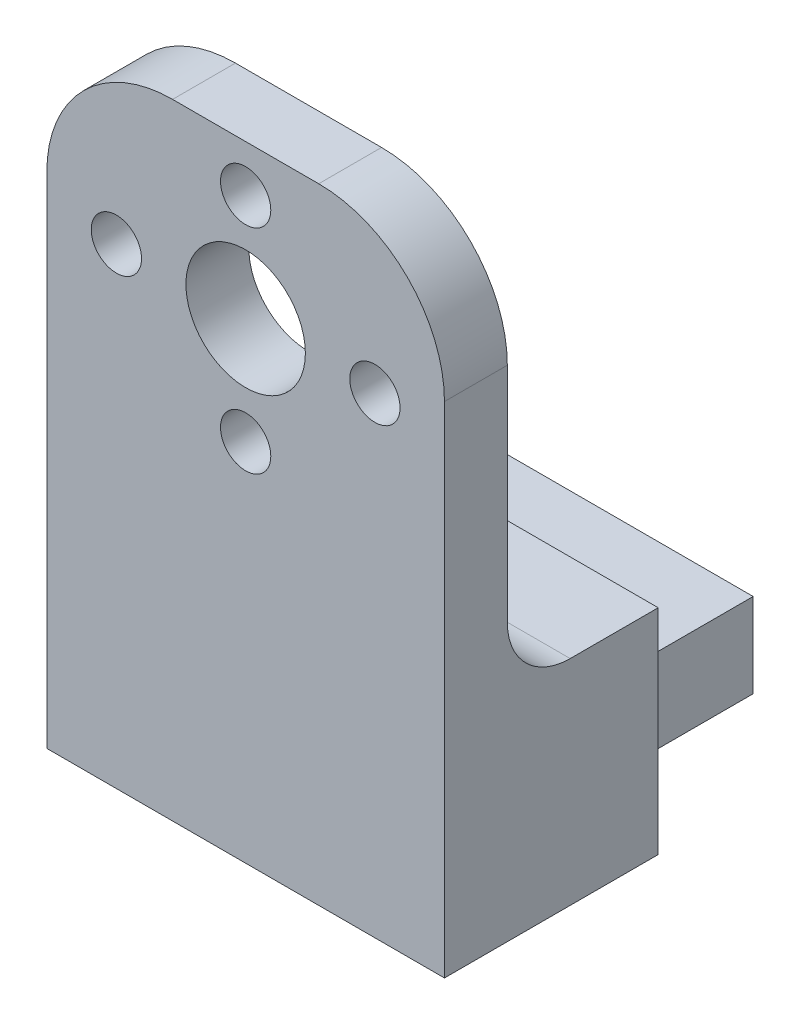
ISO-10303-21;
HEADER;
FILE_DESCRIPTION(('STEP AP214'),'2;1');
FILE_NAME('part.step','',(''),(''),'','','');
FILE_SCHEMA(('AUTOMOTIVE_DESIGN { 1 0 10303 214 1 1 1 1 }'));
ENDSEC;
DATA;
#1=APPLICATION_CONTEXT('core data for automotive mechanical design processes');
#2=APPLICATION_PROTOCOL_DEFINITION('international standard','automotive_design',2000,#1);
#3=PRODUCT_CONTEXT('',#1,'mechanical');
#4=PRODUCT('Part','Part','',(#3));
#5=PRODUCT_RELATED_PRODUCT_CATEGORY('part','',(#4));
#6=PRODUCT_DEFINITION_FORMATION('','',#4);
#7=PRODUCT_DEFINITION_CONTEXT('part definition',#1,'design');
#8=PRODUCT_DEFINITION('design','',#6,#7);
#9=PRODUCT_DEFINITION_SHAPE('','',#8);
#10=(LENGTH_UNIT() NAMED_UNIT(*) SI_UNIT(.MILLI.,.METRE.));
#11=(NAMED_UNIT(*) PLANE_ANGLE_UNIT() SI_UNIT($,.RADIAN.));
#12=(NAMED_UNIT(*) SI_UNIT($,.STERADIAN.) SOLID_ANGLE_UNIT());
#13=UNCERTAINTY_MEASURE_WITH_UNIT(LENGTH_MEASURE(1.E-05),#10,'distance_accuracy_value','');
#14=(GEOMETRIC_REPRESENTATION_CONTEXT(3) GLOBAL_UNCERTAINTY_ASSIGNED_CONTEXT((#13)) GLOBAL_UNIT_ASSIGNED_CONTEXT((#10,
#11,#12)) REPRESENTATION_CONTEXT('',''));
#15=CARTESIAN_POINT('',(0.,0.,0.));
#16=DIRECTION('',(0.,0.,1.));
#17=DIRECTION('',(1.,0.,0.));
#18=AXIS2_PLACEMENT_3D('',#15,#16,#17);
#19=CARTESIAN_POINT('',(15.81,17.,8.49999999999973));
#20=DIRECTION('',(0.,0.,-1.));
#21=DIRECTION('',(-1.,0.,0.));
#22=AXIS2_PLACEMENT_3D('',#19,#20,#21);
#23=PLANE('',#22);
#24=CARTESIAN_POINT('',(-10.28,37.5,8.49999999999973));
#25=DIRECTION('',(0.,0.,1.));
#26=DIRECTION('',(1.,0.,0.));
#27=AXIS2_PLACEMENT_3D('',#24,#25,#26);
#28=CIRCLE('',#27,2.);
#29=CARTESIAN_POINT('',(-8.28,37.5,8.49999999999973));
#30=VERTEX_POINT('',#29);
#31=EDGE_CURVE('E251',#30,#30,#28,.T.);
#32=ORIENTED_EDGE('',*,*,#31,.F.);
#33=EDGE_LOOP('',(#32));
#34=FACE_BOUND('',#33,.T.);
#35=CARTESIAN_POINT('',(0.,45.975,8.49999999999973));
#36=DIRECTION('',(0.,0.,1.));
#37=DIRECTION('',(1.,0.,0.));
#38=AXIS2_PLACEMENT_3D('',#35,#36,#37);
#39=CIRCLE('',#38,2.);
#40=CARTESIAN_POINT('',(2.,45.975,8.49999999999973));
#41=VERTEX_POINT('',#40);
#42=EDGE_CURVE('E263',#41,#41,#39,.T.);
#43=ORIENTED_EDGE('',*,*,#42,.F.);
#44=EDGE_LOOP('',(#43));
#45=FACE_BOUND('',#44,.T.);
#46=CARTESIAN_POINT('',(0.,37.5,8.49999999999973));
#47=DIRECTION('',(0.,0.,1.));
#48=DIRECTION('',(1.,0.,0.));
#49=AXIS2_PLACEMENT_3D('',#46,#47,#48);
#50=CIRCLE('',#49,4.75);
#51=CARTESIAN_POINT('',(4.75,37.5,8.49999999999973));
#52=VERTEX_POINT('',#51);
#53=EDGE_CURVE('E242',#52,#52,#50,.T.);
#54=ORIENTED_EDGE('',*,*,#53,.F.);
#55=EDGE_LOOP('',(#54));
#56=FACE_BOUND('',#55,.T.);
#57=DIRECTION('',(1.,0.,0.));
#58=VECTOR('',#57,1.);
#59=CARTESIAN_POINT('',(15.81,49.7,8.49999999999973));
#60=LINE('',#59,#58);
#61=CARTESIAN_POINT('',(-5.81,49.7,8.49999999999973));
#62=VERTEX_POINT('',#61);
#63=CARTESIAN_POINT('',(5.81,49.7,8.49999999999973));
#64=VERTEX_POINT('',#63);
#65=EDGE_CURVE('E233',#62,#64,#60,.T.);
#66=ORIENTED_EDGE('',*,*,#65,.F.);
#67=CARTESIAN_POINT('',(-5.81,39.7,8.49999999999973));
#68=DIRECTION('',(0.,0.,-1.));
#69=DIRECTION('',(-1.,0.,0.));
#70=AXIS2_PLACEMENT_3D('',#67,#68,#69);
#71=CIRCLE('',#70,10.);
#72=CARTESIAN_POINT('',(-15.81,39.7,8.49999999999973));
#73=VERTEX_POINT('',#72);
#74=EDGE_CURVE('E206',#62,#73,#71,.F.);
#75=ORIENTED_EDGE('',*,*,#74,.T.);
#76=DIRECTION('',(0.,-1.,0.));
#77=VECTOR('',#76,1.);
#78=CARTESIAN_POINT('',(-15.81,17.,8.49999999999973));
#79=LINE('',#78,#77);
#80=CARTESIAN_POINT('',(-15.81,0.,8.49999999999973));
#81=VERTEX_POINT('',#80);
#82=EDGE_CURVE('E196',#73,#81,#79,.T.);
#83=ORIENTED_EDGE('',*,*,#82,.T.);
#84=DIRECTION('',(1.,0.,0.));
#85=VECTOR('',#84,1.);
#86=CARTESIAN_POINT('',(15.81,0.,8.49999999999973));
#87=LINE('',#86,#85);
#88=CARTESIAN_POINT('',(15.81,0.,8.49999999999973));
#89=VERTEX_POINT('',#88);
#90=EDGE_CURVE('E183',#81,#89,#87,.T.);
#91=ORIENTED_EDGE('',*,*,#90,.T.);
#92=DIRECTION('',(0.,-1.,0.));
#93=VECTOR('',#92,1.);
#94=CARTESIAN_POINT('',(15.81,17.,8.49999999999973));
#95=LINE('',#94,#93);
#96=CARTESIAN_POINT('',(15.81,39.7,8.49999999999973));
#97=VERTEX_POINT('',#96);
#98=EDGE_CURVE('E194',#97,#89,#95,.T.);
#99=ORIENTED_EDGE('',*,*,#98,.F.);
#100=CARTESIAN_POINT('',(5.81,39.7,8.49999999999973));
#101=DIRECTION('',(0.,0.,-1.));
#102=DIRECTION('',(-1.,0.,0.));
#103=AXIS2_PLACEMENT_3D('',#100,#101,#102);
#104=CIRCLE('',#103,10.);
#105=EDGE_CURVE('E204',#97,#64,#104,.F.);
#106=ORIENTED_EDGE('',*,*,#105,.T.);
#107=EDGE_LOOP('',(#66,#75,#83,#91,#99,#106));
#108=FACE_BOUND('',#107,.T.);
#109=CARTESIAN_POINT('',(10.28,37.5,8.49999999999973));
#110=DIRECTION('',(0.,0.,-1.));
#111=DIRECTION('',(-1.,0.,0.));
#112=AXIS2_PLACEMENT_3D('',#109,#110,#111);
#113=CIRCLE('',#112,2.);
#114=CARTESIAN_POINT('',(8.28,37.5,8.49999999999973));
#115=VERTEX_POINT('',#114);
#116=EDGE_CURVE('E252',#115,#115,#113,.T.);
#117=ORIENTED_EDGE('',*,*,#116,.T.);
#118=EDGE_LOOP('',(#117));
#119=FACE_BOUND('',#118,.T.);
#120=CARTESIAN_POINT('',(0.,29.025,8.49999999999973));
#121=DIRECTION('',(0.,0.,1.));
#122=DIRECTION('',(1.,0.,0.));
#123=AXIS2_PLACEMENT_3D('',#120,#121,#122);
#124=CIRCLE('',#123,2.);
#125=CARTESIAN_POINT('',(2.,29.025,8.49999999999973));
#126=VERTEX_POINT('',#125);
#127=EDGE_CURVE('E245',#126,#126,#124,.F.);
#128=ORIENTED_EDGE('',*,*,#127,.T.);
#129=EDGE_LOOP('',(#128));
#130=FACE_BOUND('',#129,.T.);
#131=ADVANCED_FACE('F35',(#34,#45,#56,#108,#119,#130),#23,.F.);
#132=CARTESIAN_POINT('',(15.81,49.7,3.49999999999973));
#133=DIRECTION('',(0.,0.,1.));
#134=DIRECTION('',(1.,0.,0.));
#135=AXIS2_PLACEMENT_3D('',#132,#133,#134);
#136=PLANE('',#135);
#137=CARTESIAN_POINT('',(-10.28,37.5,3.49999999999973));
#138=DIRECTION('',(0.,0.,1.));
#139=DIRECTION('',(1.,0.,0.));
#140=AXIS2_PLACEMENT_3D('',#137,#138,#139);
#141=CIRCLE('',#140,2.);
#142=CARTESIAN_POINT('',(-8.28,37.5,3.49999999999973));
#143=VERTEX_POINT('',#142);
#144=EDGE_CURVE('E248',#143,#143,#141,.T.);
#145=ORIENTED_EDGE('',*,*,#144,.T.);
#146=EDGE_LOOP('',(#145));
#147=FACE_BOUND('',#146,.T.);
#148=CARTESIAN_POINT('',(0.,45.975,3.49999999999973));
#149=DIRECTION('',(0.,0.,1.));
#150=DIRECTION('',(1.,0.,0.));
#151=AXIS2_PLACEMENT_3D('',#148,#149,#150);
#152=CIRCLE('',#151,2.);
#153=CARTESIAN_POINT('',(2.,45.975,3.49999999999973));
#154=VERTEX_POINT('',#153);
#155=EDGE_CURVE('E260',#154,#154,#152,.T.);
#156=ORIENTED_EDGE('',*,*,#155,.T.);
#157=EDGE_LOOP('',(#156));
#158=FACE_BOUND('',#157,.T.);
#159=CARTESIAN_POINT('',(0.,37.5,3.49999999999973));
#160=DIRECTION('',(0.,0.,1.));
#161=DIRECTION('',(1.,0.,0.));
#162=AXIS2_PLACEMENT_3D('',#159,#160,#161);
#163=CIRCLE('',#162,4.75);
#164=CARTESIAN_POINT('',(4.75,37.5,3.49999999999973));
#165=VERTEX_POINT('',#164);
#166=EDGE_CURVE('E241',#165,#165,#163,.T.);
#167=ORIENTED_EDGE('',*,*,#166,.T.);
#168=EDGE_LOOP('',(#167));
#169=FACE_BOUND('',#168,.T.);
#170=DIRECTION('',(0.,-1.,0.));
#171=VECTOR('',#170,1.);
#172=CARTESIAN_POINT('',(15.81,49.7,3.49999999999973));
#173=LINE('',#172,#171);
#174=CARTESIAN_POINT('',(15.81,39.7,3.49999999999973));
#175=VERTEX_POINT('',#174);
#176=CARTESIAN_POINT('',(15.81,22.,3.49999999999973));
#177=VERTEX_POINT('',#176);
#178=EDGE_CURVE('E162',#175,#177,#173,.T.);
#179=ORIENTED_EDGE('',*,*,#178,.T.);
#180=DIRECTION('',(-1.,0.,0.));
#181=VECTOR('',#180,1.);
#182=CARTESIAN_POINT('',(-15.81,22.,3.49999999999973));
#183=LINE('',#182,#181);
#184=CARTESIAN_POINT('',(-15.81,22.,3.49999999999973));
#185=VERTEX_POINT('',#184);
#186=EDGE_CURVE('E216',#177,#185,#183,.T.);
#187=ORIENTED_EDGE('',*,*,#186,.T.);
#188=DIRECTION('',(0.,-1.,0.));
#189=VECTOR('',#188,1.);
#190=CARTESIAN_POINT('',(-15.81,49.7,3.49999999999973));
#191=LINE('',#190,#189);
#192=CARTESIAN_POINT('',(-15.81,39.7,3.49999999999973));
#193=VERTEX_POINT('',#192);
#194=EDGE_CURVE('E225',#193,#185,#191,.T.);
#195=ORIENTED_EDGE('',*,*,#194,.F.);
#196=CARTESIAN_POINT('',(-5.81,39.7,3.49999999999973));
#197=DIRECTION('',(0.,0.,1.));
#198=DIRECTION('',(1.,0.,0.));
#199=AXIS2_PLACEMENT_3D('',#196,#197,#198);
#200=CIRCLE('',#199,10.);
#201=CARTESIAN_POINT('',(-5.81,49.7,3.49999999999973));
#202=VERTEX_POINT('',#201);
#203=EDGE_CURVE('E212',#193,#202,#200,.F.);
#204=ORIENTED_EDGE('',*,*,#203,.T.);
#205=DIRECTION('',(-1.,0.,0.));
#206=VECTOR('',#205,1.);
#207=CARTESIAN_POINT('',(15.81,49.7,3.49999999999973));
#208=LINE('',#207,#206);
#209=CARTESIAN_POINT('',(5.81,49.7,3.49999999999973));
#210=VERTEX_POINT('',#209);
#211=EDGE_CURVE('E236',#210,#202,#208,.T.);
#212=ORIENTED_EDGE('',*,*,#211,.F.);
#213=CARTESIAN_POINT('',(5.81,39.7,3.49999999999973));
#214=DIRECTION('',(0.,0.,1.));
#215=DIRECTION('',(1.,0.,0.));
#216=AXIS2_PLACEMENT_3D('',#213,#214,#215);
#217=CIRCLE('',#216,10.);
#218=EDGE_CURVE('E210',#210,#175,#217,.F.);
#219=ORIENTED_EDGE('',*,*,#218,.T.);
#220=EDGE_LOOP('',(#179,#187,#195,#204,#212,#219));
#221=FACE_BOUND('',#220,.T.);
#222=CARTESIAN_POINT('',(10.28,37.5,3.49999999999973));
#223=DIRECTION('',(0.,0.,-1.));
#224=DIRECTION('',(-1.,0.,0.));
#225=AXIS2_PLACEMENT_3D('',#222,#223,#224);
#226=CIRCLE('',#225,2.);
#227=CARTESIAN_POINT('',(8.28,37.5,3.49999999999973));
#228=VERTEX_POINT('',#227);
#229=EDGE_CURVE('E266',#228,#228,#226,.T.);
#230=ORIENTED_EDGE('',*,*,#229,.F.);
#231=EDGE_LOOP('',(#230));
#232=FACE_BOUND('',#231,.T.);
#233=CARTESIAN_POINT('',(0.,29.025,3.49999999999973));
#234=DIRECTION('',(0.,0.,1.));
#235=DIRECTION('',(1.,0.,0.));
#236=AXIS2_PLACEMENT_3D('',#233,#234,#235);
#237=CIRCLE('',#236,2.);
#238=CARTESIAN_POINT('',(2.,29.025,3.49999999999973));
#239=VERTEX_POINT('',#238);
#240=EDGE_CURVE('E255',#239,#239,#237,.F.);
#241=ORIENTED_EDGE('',*,*,#240,.F.);
#242=EDGE_LOOP('',(#241));
#243=FACE_BOUND('',#242,.T.);
#244=ADVANCED_FACE('F223',(#147,#158,#169,#221,#232,#243),#136,.F.);
#245=CARTESIAN_POINT('',(0.,17.,0.));
#246=DIRECTION('',(0.,-1.,0.));
#247=DIRECTION('',(0.,0.,-1.));
#248=AXIS2_PLACEMENT_3D('',#245,#246,#247);
#249=PLANE('',#248);
#250=DIRECTION('',(0.,0.,1.));
#251=VECTOR('',#250,1.);
#252=CARTESIAN_POINT('',(-15.81,17.,-8.49999999999973));
#253=LINE('',#252,#251);
#254=CARTESIAN_POINT('',(-15.81,17.,-8.49999999999973));
#255=VERTEX_POINT('',#254);
#256=CARTESIAN_POINT('',(-15.81,17.,-1.50000000000027));
#257=VERTEX_POINT('',#256);
#258=EDGE_CURVE('E173',#255,#257,#253,.T.);
#259=ORIENTED_EDGE('',*,*,#258,.T.);
#260=DIRECTION('',(-1.,0.,0.));
#261=VECTOR('',#260,1.);
#262=CARTESIAN_POINT('',(15.81,17.,-1.50000000000027));
#263=LINE('',#262,#261);
#264=CARTESIAN_POINT('',(15.81,17.,-1.50000000000027));
#265=VERTEX_POINT('',#264);
#266=EDGE_CURVE('E56',#257,#265,#263,.F.);
#267=ORIENTED_EDGE('',*,*,#266,.T.);
#268=DIRECTION('',(0.,0.,-1.));
#269=VECTOR('',#268,1.);
#270=CARTESIAN_POINT('',(15.81,17.,-8.49999999999974));
#271=LINE('',#270,#269);
#272=CARTESIAN_POINT('',(15.81,17.,-8.49999999999974));
#273=VERTEX_POINT('',#272);
#274=EDGE_CURVE('E175',#265,#273,#271,.T.);
#275=ORIENTED_EDGE('',*,*,#274,.T.);
#276=DIRECTION('',(-1.,0.,0.));
#277=VECTOR('',#276,1.);
#278=CARTESIAN_POINT('',(15.81,17.,-8.49999999999974));
#279=LINE('',#278,#277);
#280=EDGE_CURVE('E178',#273,#255,#279,.T.);
#281=ORIENTED_EDGE('',*,*,#280,.T.);
#282=EDGE_LOOP('',(#259,#267,#275,#281));
#283=FACE_BOUND('',#282,.T.);
#284=ADVANCED_FACE('F296',(#283),#249,.F.);
#285=CARTESIAN_POINT('',(-15.81,17.,-8.49999999999973));
#286=DIRECTION('',(1.,0.,0.));
#287=DIRECTION('',(0.,0.,-1.));
#288=AXIS2_PLACEMENT_3D('',#285,#286,#287);
#289=PLANE('',#288);
#290=ORIENTED_EDGE('',*,*,#82,.F.);
#291=DIRECTION('',(0.,0.,1.));
#292=VECTOR('',#291,1.);
#293=CARTESIAN_POINT('',(-15.81,39.7,-8.49999999999973));
#294=LINE('',#293,#292);
#295=EDGE_CURVE('E208',#73,#193,#294,.F.);
#296=ORIENTED_EDGE('',*,*,#295,.T.);
#297=ORIENTED_EDGE('',*,*,#194,.T.);
#298=CARTESIAN_POINT('',(-15.81,22.,-1.50000000000027));
#299=DIRECTION('',(1.,0.,0.));
#300=DIRECTION('',(0.,0.,-1.));
#301=AXIS2_PLACEMENT_3D('',#298,#299,#300);
#302=CIRCLE('',#301,5.);
#303=EDGE_CURVE('E43',#185,#257,#302,.T.);
#304=ORIENTED_EDGE('',*,*,#303,.T.);
#305=ORIENTED_EDGE('',*,*,#258,.F.);
#306=DIRECTION('',(0.,-1.,0.));
#307=VECTOR('',#306,1.);
#308=CARTESIAN_POINT('',(-15.81,17.,-8.49999999999973));
#309=LINE('',#308,#307);
#310=CARTESIAN_POINT('',(-15.81,0.,-8.49999999999973));
#311=VERTEX_POINT('',#310);
#312=EDGE_CURVE('E180',#255,#311,#309,.T.);
#313=ORIENTED_EDGE('',*,*,#312,.T.);
#314=DIRECTION('',(0.,0.,1.));
#315=VECTOR('',#314,1.);
#316=CARTESIAN_POINT('',(-15.81,0.,-8.49999999999973));
#317=LINE('',#316,#315);
#318=EDGE_CURVE('E139',#311,#81,#317,.T.);
#319=ORIENTED_EDGE('',*,*,#318,.T.);
#320=EDGE_LOOP('',(#290,#296,#297,#304,#305,#313,#319));
#321=FACE_BOUND('',#320,.T.);
#322=ADVANCED_FACE('F231',(#321),#289,.F.);
#323=CARTESIAN_POINT('',(15.81,17.,-8.49999999999974));
#324=DIRECTION('',(-1.,0.,0.));
#325=DIRECTION('',(0.,0.,1.));
#326=AXIS2_PLACEMENT_3D('',#323,#324,#325);
#327=PLANE('',#326);
#328=ORIENTED_EDGE('',*,*,#178,.F.);
#329=DIRECTION('',(0.,0.,-1.));
#330=VECTOR('',#329,1.);
#331=CARTESIAN_POINT('',(15.81,39.7,-8.49999999999974));
#332=LINE('',#331,#330);
#333=EDGE_CURVE('E214',#175,#97,#332,.F.);
#334=ORIENTED_EDGE('',*,*,#333,.T.);
#335=ORIENTED_EDGE('',*,*,#98,.T.);
#336=DIRECTION('',(0.,0.,-1.));
#337=VECTOR('',#336,1.);
#338=CARTESIAN_POINT('',(15.81,0.,-8.49999999999974));
#339=LINE('',#338,#337);
#340=CARTESIAN_POINT('',(15.81,0.,-8.49999999999974));
#341=VERTEX_POINT('',#340);
#342=EDGE_CURVE('E186',#89,#341,#339,.T.);
#343=ORIENTED_EDGE('',*,*,#342,.T.);
#344=DIRECTION('',(0.,-1.,0.));
#345=VECTOR('',#344,1.);
#346=CARTESIAN_POINT('',(15.81,17.,-8.49999999999974));
#347=LINE('',#346,#345);
#348=EDGE_CURVE('E191',#273,#341,#347,.T.);
#349=ORIENTED_EDGE('',*,*,#348,.F.);
#350=ORIENTED_EDGE('',*,*,#274,.F.);
#351=CARTESIAN_POINT('',(15.81,22.,-1.50000000000027));
#352=DIRECTION('',(-1.,0.,0.));
#353=DIRECTION('',(0.,0.,1.));
#354=AXIS2_PLACEMENT_3D('',#351,#352,#353);
#355=CIRCLE('',#354,5.);
#356=EDGE_CURVE('E11',#265,#177,#355,.T.);
#357=ORIENTED_EDGE('',*,*,#356,.T.);
#358=EDGE_LOOP('',(#328,#334,#335,#343,#349,#350,#357));
#359=FACE_BOUND('',#358,.T.);
#360=ADVANCED_FACE('F303',(#359),#327,.F.);
#361=CARTESIAN_POINT('',(15.81,17.,-8.49999999999974));
#362=DIRECTION('',(0.,0.,1.));
#363=DIRECTION('',(1.,0.,0.));
#364=AXIS2_PLACEMENT_3D('',#361,#362,#363);
#365=PLANE('',#364);
#366=DIRECTION('',(-1.,0.,0.));
#367=VECTOR('',#366,1.);
#368=CARTESIAN_POINT('',(0.,11.85,-8.49999999999973));
#369=LINE('',#368,#367);
#370=CARTESIAN_POINT('',(13.66,11.85,-8.49999999999974));
#371=VERTEX_POINT('',#370);
#372=CARTESIAN_POINT('',(-13.66,11.85,-8.49999999999973));
#373=VERTEX_POINT('',#372);
#374=EDGE_CURVE('E161',#371,#373,#369,.T.);
#375=ORIENTED_EDGE('',*,*,#374,.T.);
#376=DIRECTION('',(0.,-1.,0.));
#377=VECTOR('',#376,1.);
#378=CARTESIAN_POINT('',(-13.66,0.,-8.49999999999973));
#379=LINE('',#378,#377);
#380=CARTESIAN_POINT('',(-13.66,5.15,-8.49999999999973));
#381=VERTEX_POINT('',#380);
#382=EDGE_CURVE('E134',#373,#381,#379,.T.);
#383=ORIENTED_EDGE('',*,*,#382,.T.);
#384=DIRECTION('',(-1.,0.,0.));
#385=VECTOR('',#384,1.);
#386=CARTESIAN_POINT('',(0.,5.15,-8.49999999999973));
#387=LINE('',#386,#385);
#388=CARTESIAN_POINT('',(13.66,5.15,-8.49999999999974));
#389=VERTEX_POINT('',#388);
#390=EDGE_CURVE('E149',#389,#381,#387,.T.);
#391=ORIENTED_EDGE('',*,*,#390,.F.);
#392=DIRECTION('',(0.,-1.,0.));
#393=VECTOR('',#392,1.);
#394=CARTESIAN_POINT('',(13.66,0.,-8.49999999999974));
#395=LINE('',#394,#393);
#396=EDGE_CURVE('E164',#371,#389,#395,.T.);
#397=ORIENTED_EDGE('',*,*,#396,.F.);
#398=EDGE_LOOP('',(#375,#383,#391,#397));
#399=FACE_BOUND('',#398,.T.);
#400=DIRECTION('',(-1.,0.,0.));
#401=VECTOR('',#400,1.);
#402=CARTESIAN_POINT('',(15.81,0.,-8.49999999999974));
#403=LINE('',#402,#401);
#404=EDGE_CURVE('E176',#341,#311,#403,.T.);
#405=ORIENTED_EDGE('',*,*,#404,.T.);
#406=ORIENTED_EDGE('',*,*,#312,.F.);
#407=ORIENTED_EDGE('',*,*,#280,.F.);
#408=ORIENTED_EDGE('',*,*,#348,.T.);
#409=EDGE_LOOP('',(#405,#406,#407,#408));
#410=FACE_BOUND('',#409,.T.);
#411=ADVANCED_FACE('F337',(#399,#410),#365,.F.);
#412=CARTESIAN_POINT('',(0.,0.,0.));
#413=DIRECTION('',(0.,-1.,0.));
#414=DIRECTION('',(0.,0.,-1.));
#415=AXIS2_PLACEMENT_3D('',#412,#413,#414);
#416=PLANE('',#415);
#417=ORIENTED_EDGE('',*,*,#318,.F.);
#418=ORIENTED_EDGE('',*,*,#404,.F.);
#419=ORIENTED_EDGE('',*,*,#342,.F.);
#420=ORIENTED_EDGE('',*,*,#90,.F.);
#421=EDGE_LOOP('',(#417,#418,#419,#420));
#422=FACE_BOUND('',#421,.T.);
#423=ADVANCED_FACE('F331',(#422),#416,.T.);
#424=CARTESIAN_POINT('',(-13.66,0.,-18.1999999999997));
#425=DIRECTION('',(-1.,0.,0.));
#426=DIRECTION('',(0.,0.,1.));
#427=AXIS2_PLACEMENT_3D('',#424,#425,#426);
#428=PLANE('',#427);
#429=ORIENTED_EDGE('',*,*,#382,.F.);
#430=DIRECTION('',(0.,0.,1.));
#431=VECTOR('',#430,1.);
#432=CARTESIAN_POINT('',(-13.66,11.85,-18.1999999999997));
#433=LINE('',#432,#431);
#434=CARTESIAN_POINT('',(-13.66,11.85,-18.1999999999997));
#435=VERTEX_POINT('',#434);
#436=EDGE_CURVE('E129',#435,#373,#433,.T.);
#437=ORIENTED_EDGE('',*,*,#436,.F.);
#438=DIRECTION('',(0.,-1.,0.));
#439=VECTOR('',#438,1.);
#440=CARTESIAN_POINT('',(-13.66,0.,-18.1999999999997));
#441=LINE('',#440,#439);
#442=CARTESIAN_POINT('',(-13.66,5.15,-18.1999999999997));
#443=VERTEX_POINT('',#442);
#444=EDGE_CURVE('E132',#435,#443,#441,.T.);
#445=ORIENTED_EDGE('',*,*,#444,.T.);
#446=DIRECTION('',(0.,0.,1.));
#447=VECTOR('',#446,1.);
#448=CARTESIAN_POINT('',(-13.66,5.15,-18.1999999999997));
#449=LINE('',#448,#447);
#450=EDGE_CURVE('E159',#443,#381,#449,.T.);
#451=ORIENTED_EDGE('',*,*,#450,.T.);
#452=EDGE_LOOP('',(#429,#437,#445,#451));
#453=FACE_BOUND('',#452,.T.);
#454=ADVANCED_FACE('F131',(#453),#428,.T.);
#455=CARTESIAN_POINT('',(0.,11.85,-18.1999999999997));
#456=DIRECTION('',(0.,1.,0.));
#457=DIRECTION('',(0.,0.,1.));
#458=AXIS2_PLACEMENT_3D('',#455,#456,#457);
#459=PLANE('',#458);
#460=ORIENTED_EDGE('',*,*,#374,.F.);
#461=DIRECTION('',(0.,0.,1.));
#462=VECTOR('',#461,1.);
#463=CARTESIAN_POINT('',(13.66,11.85,-18.1999999999997));
#464=LINE('',#463,#462);
#465=CARTESIAN_POINT('',(13.66,11.85,-18.1999999999997));
#466=VERTEX_POINT('',#465);
#467=EDGE_CURVE('E140',#466,#371,#464,.T.);
#468=ORIENTED_EDGE('',*,*,#467,.F.);
#469=DIRECTION('',(-1.,0.,0.));
#470=VECTOR('',#469,1.);
#471=CARTESIAN_POINT('',(0.,11.85,-18.1999999999997));
#472=LINE('',#471,#470);
#473=EDGE_CURVE('E145',#466,#435,#472,.T.);
#474=ORIENTED_EDGE('',*,*,#473,.T.);
#475=ORIENTED_EDGE('',*,*,#436,.T.);
#476=EDGE_LOOP('',(#460,#468,#474,#475));
#477=FACE_BOUND('',#476,.T.);
#478=ADVANCED_FACE('F151',(#477),#459,.T.);
#479=CARTESIAN_POINT('',(13.66,0.,-18.1999999999997));
#480=DIRECTION('',(-1.,0.,0.));
#481=DIRECTION('',(0.,0.,1.));
#482=AXIS2_PLACEMENT_3D('',#479,#480,#481);
#483=PLANE('',#482);
#484=ORIENTED_EDGE('',*,*,#396,.T.);
#485=DIRECTION('',(0.,0.,1.));
#486=VECTOR('',#485,1.);
#487=CARTESIAN_POINT('',(13.66,5.15,-18.1999999999997));
#488=LINE('',#487,#486);
#489=CARTESIAN_POINT('',(13.66,5.15,-18.1999999999997));
#490=VERTEX_POINT('',#489);
#491=EDGE_CURVE('E169',#490,#389,#488,.T.);
#492=ORIENTED_EDGE('',*,*,#491,.F.);
#493=DIRECTION('',(0.,-1.,0.));
#494=VECTOR('',#493,1.);
#495=CARTESIAN_POINT('',(13.66,0.,-18.1999999999997));
#496=LINE('',#495,#494);
#497=EDGE_CURVE('E153',#466,#490,#496,.T.);
#498=ORIENTED_EDGE('',*,*,#497,.F.);
#499=ORIENTED_EDGE('',*,*,#467,.T.);
#500=EDGE_LOOP('',(#484,#492,#498,#499));
#501=FACE_BOUND('',#500,.T.);
#502=ADVANCED_FACE('F355',(#501),#483,.F.);
#503=CARTESIAN_POINT('',(0.,5.15,-18.1999999999997));
#504=DIRECTION('',(0.,1.,0.));
#505=DIRECTION('',(0.,0.,1.));
#506=AXIS2_PLACEMENT_3D('',#503,#504,#505);
#507=PLANE('',#506);
#508=ORIENTED_EDGE('',*,*,#390,.T.);
#509=ORIENTED_EDGE('',*,*,#450,.F.);
#510=DIRECTION('',(-1.,0.,0.));
#511=VECTOR('',#510,1.);
#512=CARTESIAN_POINT('',(0.,5.15,-18.1999999999997));
#513=LINE('',#512,#511);
#514=EDGE_CURVE('E147',#490,#443,#513,.T.);
#515=ORIENTED_EDGE('',*,*,#514,.F.);
#516=ORIENTED_EDGE('',*,*,#491,.T.);
#517=EDGE_LOOP('',(#508,#509,#515,#516));
#518=FACE_BOUND('',#517,.T.);
#519=ADVANCED_FACE('F357',(#518),#507,.F.);
#520=CARTESIAN_POINT('',(0.,0.,-18.1999999999997));
#521=DIRECTION('',(0.,0.,-1.));
#522=DIRECTION('',(-1.,0.,0.));
#523=AXIS2_PLACEMENT_3D('',#520,#521,#522);
#524=PLANE('',#523);
#525=ORIENTED_EDGE('',*,*,#444,.F.);
#526=ORIENTED_EDGE('',*,*,#473,.F.);
#527=ORIENTED_EDGE('',*,*,#497,.T.);
#528=ORIENTED_EDGE('',*,*,#514,.T.);
#529=EDGE_LOOP('',(#525,#526,#527,#528));
#530=FACE_BOUND('',#529,.T.);
#531=ADVANCED_FACE('F144',(#530),#524,.T.);
#532=CARTESIAN_POINT('',(0.,49.7,0.));
#533=DIRECTION('',(0.,-1.,0.));
#534=DIRECTION('',(0.,0.,-1.));
#535=AXIS2_PLACEMENT_3D('',#532,#533,#534);
#536=PLANE('',#535);
#537=ORIENTED_EDGE('',*,*,#211,.T.);
#538=DIRECTION('',(0.,0.,1.));
#539=VECTOR('',#538,1.);
#540=CARTESIAN_POINT('',(-5.81,49.7,0.));
#541=LINE('',#540,#539);
#542=EDGE_CURVE('E201',#202,#62,#541,.T.);
#543=ORIENTED_EDGE('',*,*,#542,.T.);
#544=ORIENTED_EDGE('',*,*,#65,.T.);
#545=DIRECTION('',(0.,0.,-1.));
#546=VECTOR('',#545,1.);
#547=CARTESIAN_POINT('',(5.81,49.7,0.));
#548=LINE('',#547,#546);
#549=EDGE_CURVE('E198',#64,#210,#548,.T.);
#550=ORIENTED_EDGE('',*,*,#549,.T.);
#551=EDGE_LOOP('',(#537,#543,#544,#550));
#552=FACE_BOUND('',#551,.T.);
#553=ADVANCED_FACE('F323',(#552),#536,.F.);
#554=CARTESIAN_POINT('',(0.,37.5,3.49999999999973));
#555=DIRECTION('',(0.,0.,1.));
#556=DIRECTION('',(1.,0.,0.));
#557=AXIS2_PLACEMENT_3D('',#554,#555,#556);
#558=CYLINDRICAL_SURFACE('',#557,4.75);
#559=ORIENTED_EDGE('',*,*,#166,.F.);
#560=EDGE_LOOP('',(#559));
#561=FACE_BOUND('',#560,.T.);
#562=ORIENTED_EDGE('',*,*,#53,.T.);
#563=EDGE_LOOP('',(#562));
#564=FACE_BOUND('',#563,.T.);
#565=ADVANCED_FACE('F287',(#561,#564),#558,.F.);
#566=CARTESIAN_POINT('',(0.,45.975,3.49999999999973));
#567=DIRECTION('',(0.,0.,1.));
#568=DIRECTION('',(1.,0.,0.));
#569=AXIS2_PLACEMENT_3D('',#566,#567,#568);
#570=CYLINDRICAL_SURFACE('',#569,2.);
#571=ORIENTED_EDGE('',*,*,#155,.F.);
#572=EDGE_LOOP('',(#571));
#573=FACE_BOUND('',#572,.T.);
#574=ORIENTED_EDGE('',*,*,#42,.T.);
#575=EDGE_LOOP('',(#574));
#576=FACE_BOUND('',#575,.T.);
#577=ADVANCED_FACE('F277',(#573,#576),#570,.F.);
#578=CARTESIAN_POINT('',(10.28,37.5,3.49999999999973));
#579=DIRECTION('',(0.,0.,1.));
#580=DIRECTION('',(1.,0.,0.));
#581=AXIS2_PLACEMENT_3D('',#578,#579,#580);
#582=CYLINDRICAL_SURFACE('',#581,2.);
#583=ORIENTED_EDGE('',*,*,#229,.T.);
#584=EDGE_LOOP('',(#583));
#585=FACE_BOUND('',#584,.T.);
#586=ORIENTED_EDGE('',*,*,#116,.F.);
#587=EDGE_LOOP('',(#586));
#588=FACE_BOUND('',#587,.T.);
#589=ADVANCED_FACE('F274',(#585,#588),#582,.F.);
#590=CARTESIAN_POINT('',(-10.28,37.5,3.49999999999973));
#591=DIRECTION('',(0.,0.,1.));
#592=DIRECTION('',(1.,0.,0.));
#593=AXIS2_PLACEMENT_3D('',#590,#591,#592);
#594=CYLINDRICAL_SURFACE('',#593,2.);
#595=ORIENTED_EDGE('',*,*,#144,.F.);
#596=EDGE_LOOP('',(#595));
#597=FACE_BOUND('',#596,.T.);
#598=ORIENTED_EDGE('',*,*,#31,.T.);
#599=EDGE_LOOP('',(#598));
#600=FACE_BOUND('',#599,.T.);
#601=ADVANCED_FACE('F276',(#597,#600),#594,.F.);
#602=CARTESIAN_POINT('',(0.,29.025,3.49999999999973));
#603=DIRECTION('',(0.,0.,1.));
#604=DIRECTION('',(1.,0.,0.));
#605=AXIS2_PLACEMENT_3D('',#602,#603,#604);
#606=CYLINDRICAL_SURFACE('',#605,2.);
#607=ORIENTED_EDGE('',*,*,#240,.T.);
#608=EDGE_LOOP('',(#607));
#609=FACE_BOUND('',#608,.T.);
#610=ORIENTED_EDGE('',*,*,#127,.F.);
#611=EDGE_LOOP('',(#610));
#612=FACE_BOUND('',#611,.T.);
#613=ADVANCED_FACE('F284',(#609,#612),#606,.F.);
#614=CARTESIAN_POINT('',(-5.81,39.7,0.));
#615=DIRECTION('',(0.,0.,1.));
#616=DIRECTION('',(1.,0.,0.));
#617=AXIS2_PLACEMENT_3D('',#614,#615,#616);
#618=CYLINDRICAL_SURFACE('',#617,10.);
#619=ORIENTED_EDGE('',*,*,#203,.F.);
#620=ORIENTED_EDGE('',*,*,#295,.F.);
#621=ORIENTED_EDGE('',*,*,#74,.F.);
#622=ORIENTED_EDGE('',*,*,#542,.F.);
#623=EDGE_LOOP('',(#619,#620,#621,#622));
#624=FACE_BOUND('',#623,.T.);
#625=ADVANCED_FACE('F307',(#624),#618,.T.);
#626=CARTESIAN_POINT('',(5.81,39.7,0.));
#627=DIRECTION('',(0.,0.,-1.));
#628=DIRECTION('',(-1.,0.,0.));
#629=AXIS2_PLACEMENT_3D('',#626,#627,#628);
#630=CYLINDRICAL_SURFACE('',#629,10.);
#631=ORIENTED_EDGE('',*,*,#105,.F.);
#632=ORIENTED_EDGE('',*,*,#333,.F.);
#633=ORIENTED_EDGE('',*,*,#218,.F.);
#634=ORIENTED_EDGE('',*,*,#549,.F.);
#635=EDGE_LOOP('',(#631,#632,#633,#634));
#636=FACE_BOUND('',#635,.T.);
#637=ADVANCED_FACE('F309',(#636),#630,.T.);
#638=CARTESIAN_POINT('',(15.81,22.,-1.50000000000027));
#639=DIRECTION('',(1.,0.,0.));
#640=DIRECTION('',(0.,0.,-1.));
#641=AXIS2_PLACEMENT_3D('',#638,#639,#640);
#642=CYLINDRICAL_SURFACE('',#641,5.);
#643=ORIENTED_EDGE('',*,*,#356,.F.);
#644=ORIENTED_EDGE('',*,*,#266,.F.);
#645=ORIENTED_EDGE('',*,*,#303,.F.);
#646=ORIENTED_EDGE('',*,*,#186,.F.);
#647=EDGE_LOOP('',(#643,#644,#645,#646));
#648=FACE_BOUND('',#647,.T.);
#649=ADVANCED_FACE('F37',(#648),#642,.F.);
#650=CLOSED_SHELL('',(#131,#244,#284,#322,#360,#411,#423,#454,#478,#502,#519,#531,#553,#565,
#577,#589,#601,#613,#625,#637,#649));
#651=MANIFOLD_SOLID_BREP('B2',#650);
#652=ADVANCED_BREP_SHAPE_REPRESENTATION('',(#18,#651),#14);
#653=SHAPE_DEFINITION_REPRESENTATION(#9,#652);
ENDSEC;
END-ISO-10303-21;
